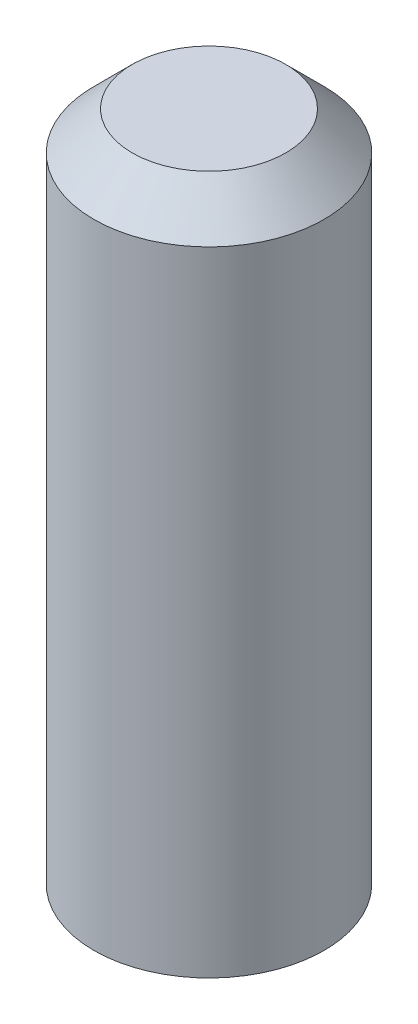
ISO-10303-21;
HEADER;
FILE_DESCRIPTION(('STEP AP214'),'2;1');
FILE_NAME('part.step','',(''),(''),'','','');
FILE_SCHEMA(('AUTOMOTIVE_DESIGN { 1 0 10303 214 1 1 1 1 }'));
ENDSEC;
DATA;
#1=APPLICATION_CONTEXT('core data for automotive mechanical design processes');
#2=APPLICATION_PROTOCOL_DEFINITION('international standard','automotive_design',2000,#1);
#3=PRODUCT_CONTEXT('',#1,'mechanical');
#4=PRODUCT('Part','Part','',(#3));
#5=PRODUCT_RELATED_PRODUCT_CATEGORY('part','',(#4));
#6=PRODUCT_DEFINITION_FORMATION('','',#4);
#7=PRODUCT_DEFINITION_CONTEXT('part definition',#1,'design');
#8=PRODUCT_DEFINITION('design','',#6,#7);
#9=PRODUCT_DEFINITION_SHAPE('','',#8);
#10=(LENGTH_UNIT() NAMED_UNIT(*) SI_UNIT(.MILLI.,.METRE.));
#11=(NAMED_UNIT(*) PLANE_ANGLE_UNIT() SI_UNIT($,.RADIAN.));
#12=(NAMED_UNIT(*) SI_UNIT($,.STERADIAN.) SOLID_ANGLE_UNIT());
#13=UNCERTAINTY_MEASURE_WITH_UNIT(LENGTH_MEASURE(1.E-05),#10,'distance_accuracy_value','');
#14=(GEOMETRIC_REPRESENTATION_CONTEXT(3) GLOBAL_UNCERTAINTY_ASSIGNED_CONTEXT((#13)) GLOBAL_UNIT_ASSIGNED_CONTEXT((#10,
#11,#12)) REPRESENTATION_CONTEXT('',''));
#15=CARTESIAN_POINT('',(0.,0.,0.));
#16=DIRECTION('',(0.,0.,1.));
#17=DIRECTION('',(1.,0.,0.));
#18=AXIS2_PLACEMENT_3D('',#15,#16,#17);
#19=CARTESIAN_POINT('',(0.,35.,0.));
#20=DIRECTION('',(0.,-1.,0.));
#21=DIRECTION('',(0.,0.,-1.));
#22=AXIS2_PLACEMENT_3D('',#19,#20,#21);
#23=CYLINDRICAL_SURFACE('',#22,6.);
#24=CARTESIAN_POINT('',(0.,33.,0.));
#25=DIRECTION('',(0.,1.,0.));
#26=DIRECTION('',(0.,0.,1.));
#27=AXIS2_PLACEMENT_3D('',#24,#25,#26);
#28=CIRCLE('',#27,6.);
#29=CARTESIAN_POINT('',(0.,33.,6.));
#30=VERTEX_POINT('',#29);
#31=EDGE_CURVE('E10',#30,#30,#28,.F.);
#32=ORIENTED_EDGE('',*,*,#31,.T.);
#33=EDGE_LOOP('',(#32));
#34=FACE_BOUND('',#33,.T.);
#35=CARTESIAN_POINT('',(0.,0.,0.));
#36=DIRECTION('',(0.,1.,0.));
#37=DIRECTION('',(0.,0.,1.));
#38=AXIS2_PLACEMENT_3D('',#35,#36,#37);
#39=CIRCLE('',#38,6.);
#40=CARTESIAN_POINT('',(0.,0.,6.));
#41=VERTEX_POINT('',#40);
#42=EDGE_CURVE('E52',#41,#41,#39,.T.);
#43=ORIENTED_EDGE('',*,*,#42,.T.);
#44=EDGE_LOOP('',(#43));
#45=FACE_BOUND('',#44,.T.);
#46=ADVANCED_FACE('F37',(#34,#45),#23,.T.);
#47=CARTESIAN_POINT('',(0.,35.,0.));
#48=DIRECTION('',(0.,1.,0.));
#49=DIRECTION('',(0.,0.,1.));
#50=AXIS2_PLACEMENT_3D('',#47,#48,#49);
#51=PLANE('',#50);
#52=CARTESIAN_POINT('',(0.,35.,0.));
#53=DIRECTION('',(0.,1.,0.));
#54=DIRECTION('',(0.,0.,1.));
#55=AXIS2_PLACEMENT_3D('',#52,#53,#54);
#56=CIRCLE('',#55,4.);
#57=CARTESIAN_POINT('',(0.,35.,4.));
#58=VERTEX_POINT('',#57);
#59=EDGE_CURVE('E46',#58,#58,#56,.T.);
#60=ORIENTED_EDGE('',*,*,#59,.T.);
#61=EDGE_LOOP('',(#60));
#62=FACE_BOUND('',#61,.T.);
#63=ADVANCED_FACE('F78',(#62),#51,.T.);
#64=CARTESIAN_POINT('',(0.,0.,0.));
#65=DIRECTION('',(0.,1.,0.));
#66=DIRECTION('',(0.,0.,1.));
#67=AXIS2_PLACEMENT_3D('',#64,#65,#66);
#68=PLANE('',#67);
#69=CARTESIAN_POINT('',(0.,0.,0.));
#70=DIRECTION('',(0.,-1.,0.));
#71=DIRECTION('',(0.,0.,-1.));
#72=AXIS2_PLACEMENT_3D('',#69,#70,#71);
#73=CIRCLE('',#72,3.4);
#74=CARTESIAN_POINT('',(0.,0.,-3.4));
#75=VERTEX_POINT('',#74);
#76=EDGE_CURVE('E60',#75,#75,#73,.T.);
#77=ORIENTED_EDGE('',*,*,#76,.F.);
#78=EDGE_LOOP('',(#77));
#79=FACE_BOUND('',#78,.T.);
#80=ORIENTED_EDGE('',*,*,#42,.F.);
#81=EDGE_LOOP('',(#80));
#82=FACE_BOUND('',#81,.T.);
#83=ADVANCED_FACE('F75',(#79,#82),#68,.F.);
#84=CARTESIAN_POINT('',(0.,35.,0.));
#85=DIRECTION('',(0.,-1.,0.));
#86=DIRECTION('',(0.,0.,-1.));
#87=AXIS2_PLACEMENT_3D('',#84,#85,#86);
#88=CONICAL_SURFACE('',#87,4.,0.785398163397445);
#89=ORIENTED_EDGE('',*,*,#31,.F.);
#90=EDGE_LOOP('',(#89));
#91=FACE_BOUND('',#90,.T.);
#92=ORIENTED_EDGE('',*,*,#59,.F.);
#93=EDGE_LOOP('',(#92));
#94=FACE_BOUND('',#93,.T.);
#95=ADVANCED_FACE('F40',(#91,#94),#88,.T.);
#96=CARTESIAN_POINT('',(0.,25.,0.));
#97=DIRECTION('',(0.,-1.,0.));
#98=DIRECTION('',(0.,0.,-1.));
#99=AXIS2_PLACEMENT_3D('',#96,#97,#98);
#100=CYLINDRICAL_SURFACE('',#99,3.4);
#101=CARTESIAN_POINT('',(0.,25.,0.));
#102=DIRECTION('',(0.,-1.,0.));
#103=DIRECTION('',(0.,0.,-1.));
#104=AXIS2_PLACEMENT_3D('',#101,#102,#103);
#105=CIRCLE('',#104,3.4);
#106=CARTESIAN_POINT('',(0.,25.,-3.4));
#107=VERTEX_POINT('',#106);
#108=EDGE_CURVE('E57',#107,#107,#105,.T.);
#109=ORIENTED_EDGE('',*,*,#108,.F.);
#110=EDGE_LOOP('',(#109));
#111=FACE_BOUND('',#110,.T.);
#112=ORIENTED_EDGE('',*,*,#76,.T.);
#113=EDGE_LOOP('',(#112));
#114=FACE_BOUND('',#113,.T.);
#115=ADVANCED_FACE('F69',(#111,#114),#100,.F.);
#116=CARTESIAN_POINT('',(0.,25.,0.));
#117=DIRECTION('',(0.,-1.,0.));
#118=DIRECTION('',(0.,0.,-1.));
#119=AXIS2_PLACEMENT_3D('',#116,#117,#118);
#120=PLANE('',#119);
#121=ORIENTED_EDGE('',*,*,#108,.T.);
#122=EDGE_LOOP('',(#121));
#123=FACE_BOUND('',#122,.T.);
#124=ADVANCED_FACE('F67',(#123),#120,.T.);
#125=CLOSED_SHELL('',(#46,#63,#83,#95,#115,#124));
#126=MANIFOLD_SOLID_BREP('B2',#125);
#127=ADVANCED_BREP_SHAPE_REPRESENTATION('',(#18,#126),#14);
#128=SHAPE_DEFINITION_REPRESENTATION(#9,#127);
ENDSEC;
END-ISO-10303-21;
